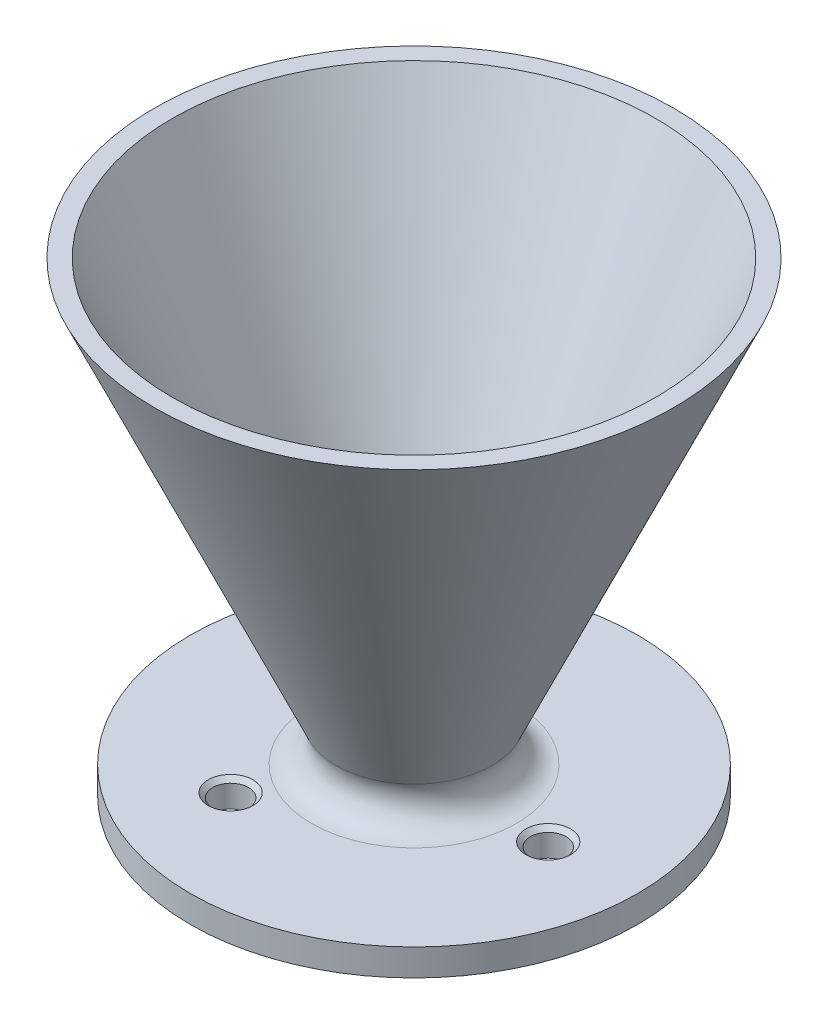
ISO-10303-21;
HEADER;
FILE_DESCRIPTION(('STEP AP214'),'2;1');
FILE_NAME('part.step','',(''),(''),'','','');
FILE_SCHEMA(('AUTOMOTIVE_DESIGN { 1 0 10303 214 1 1 1 1 }'));
ENDSEC;
DATA;
#1=APPLICATION_CONTEXT('core data for automotive mechanical design processes');
#2=APPLICATION_PROTOCOL_DEFINITION('international standard','automotive_design',2000,#1);
#3=PRODUCT_CONTEXT('',#1,'mechanical');
#4=PRODUCT('Part','Part','',(#3));
#5=PRODUCT_RELATED_PRODUCT_CATEGORY('part','',(#4));
#6=PRODUCT_DEFINITION_FORMATION('','',#4);
#7=PRODUCT_DEFINITION_CONTEXT('part definition',#1,'design');
#8=PRODUCT_DEFINITION('design','',#6,#7);
#9=PRODUCT_DEFINITION_SHAPE('','',#8);
#10=(LENGTH_UNIT() NAMED_UNIT(*) SI_UNIT(.MILLI.,.METRE.));
#11=(NAMED_UNIT(*) PLANE_ANGLE_UNIT() SI_UNIT($,.RADIAN.));
#12=(NAMED_UNIT(*) SI_UNIT($,.STERADIAN.) SOLID_ANGLE_UNIT());
#13=UNCERTAINTY_MEASURE_WITH_UNIT(LENGTH_MEASURE(1.E-05),#10,'distance_accuracy_value','');
#14=(GEOMETRIC_REPRESENTATION_CONTEXT(3) GLOBAL_UNCERTAINTY_ASSIGNED_CONTEXT((#13)) GLOBAL_UNIT_ASSIGNED_CONTEXT((#10,
#11,#12)) REPRESENTATION_CONTEXT('',''));
#15=CARTESIAN_POINT('',(0.,0.,0.));
#16=DIRECTION('',(0.,0.,1.));
#17=DIRECTION('',(1.,0.,0.));
#18=AXIS2_PLACEMENT_3D('',#15,#16,#17);
#19=CARTESIAN_POINT('',(0.,3.,0.));
#20=DIRECTION('',(0.,1.,0.));
#21=DIRECTION('',(0.,0.,1.));
#22=AXIS2_PLACEMENT_3D('',#19,#20,#21);
#23=PLANE('',#22);
#24=CARTESIAN_POINT('',(0.,3.,0.));
#25=DIRECTION('',(0.,1.,0.));
#26=DIRECTION('',(0.,0.,1.));
#27=AXIS2_PLACEMENT_3D('',#24,#25,#26);
#28=CIRCLE('',#27,11.4527198062947);
#29=CARTESIAN_POINT('',(0.,3.,11.4527198062947));
#30=VERTEX_POINT('',#29);
#31=EDGE_CURVE('E46',#30,#30,#28,.F.);
#32=ORIENTED_EDGE('',*,*,#31,.T.);
#33=EDGE_LOOP('',(#32));
#34=FACE_BOUND('',#33,.T.);
#35=CARTESIAN_POINT('',(0.,3.,0.));
#36=DIRECTION('',(0.,1.,0.));
#37=DIRECTION('',(0.,0.,1.));
#38=AXIS2_PLACEMENT_3D('',#35,#36,#37);
#39=CIRCLE('',#38,25.);
#40=CARTESIAN_POINT('',(0.,3.,25.));
#41=VERTEX_POINT('',#40);
#42=EDGE_CURVE('E50',#41,#41,#39,.T.);
#43=ORIENTED_EDGE('',*,*,#42,.T.);
#44=EDGE_LOOP('',(#43));
#45=FACE_BOUND('',#44,.T.);
#46=CARTESIAN_POINT('',(-7.49999999999988,3.,-12.9903810567666));
#47=DIRECTION('',(0.,1.,0.));
#48=DIRECTION('',(0.,0.,1.));
#49=AXIS2_PLACEMENT_3D('',#46,#47,#48);
#50=CIRCLE('',#49,2.5);
#51=CARTESIAN_POINT('',(-7.49999999999988,3.,-10.4903810567666));
#52=VERTEX_POINT('',#51);
#53=EDGE_CURVE('E68',#52,#52,#50,.T.);
#54=ORIENTED_EDGE('',*,*,#53,.F.);
#55=EDGE_LOOP('',(#54));
#56=FACE_BOUND('',#55,.T.);
#57=CARTESIAN_POINT('',(-7.50000000000006,3.,12.9903810567665));
#58=DIRECTION('',(0.,1.,0.));
#59=DIRECTION('',(0.,0.,1.));
#60=AXIS2_PLACEMENT_3D('',#57,#58,#59);
#61=CIRCLE('',#60,2.5);
#62=CARTESIAN_POINT('',(-7.50000000000006,3.,15.4903810567665));
#63=VERTEX_POINT('',#62);
#64=EDGE_CURVE('E77',#63,#63,#61,.T.);
#65=ORIENTED_EDGE('',*,*,#64,.F.);
#66=EDGE_LOOP('',(#65));
#67=FACE_BOUND('',#66,.T.);
#68=CARTESIAN_POINT('',(15.,3.,0.));
#69=DIRECTION('',(0.,1.,0.));
#70=DIRECTION('',(0.,0.,1.));
#71=AXIS2_PLACEMENT_3D('',#68,#69,#70);
#72=CIRCLE('',#71,2.5);
#73=CARTESIAN_POINT('',(15.,3.,2.5));
#74=VERTEX_POINT('',#73);
#75=EDGE_CURVE('E86',#74,#74,#72,.T.);
#76=ORIENTED_EDGE('',*,*,#75,.F.);
#77=EDGE_LOOP('',(#76));
#78=FACE_BOUND('',#77,.T.);
#79=ADVANCED_FACE('F39',(#34,#45,#56,#67,#78),#23,.T.);
#80=CARTESIAN_POINT('',(0.,0.,0.));
#81=DIRECTION('',(0.,1.,0.));
#82=DIRECTION('',(0.,0.,1.));
#83=AXIS2_PLACEMENT_3D('',#80,#81,#82);
#84=PLANE('',#83);
#85=CARTESIAN_POINT('',(15.,0.,0.));
#86=DIRECTION('',(0.,1.,0.));
#87=DIRECTION('',(0.,0.,1.));
#88=AXIS2_PLACEMENT_3D('',#85,#86,#87);
#89=CIRCLE('',#88,2.);
#90=CARTESIAN_POINT('',(15.,0.,2.));
#91=VERTEX_POINT('',#90);
#92=EDGE_CURVE('E80',#91,#91,#89,.T.);
#93=ORIENTED_EDGE('',*,*,#92,.T.);
#94=EDGE_LOOP('',(#93));
#95=FACE_BOUND('',#94,.T.);
#96=CARTESIAN_POINT('',(-7.50000000000006,0.,12.9903810567665));
#97=DIRECTION('',(0.,1.,0.));
#98=DIRECTION('',(0.,0.,1.));
#99=AXIS2_PLACEMENT_3D('',#96,#97,#98);
#100=CIRCLE('',#99,2.);
#101=CARTESIAN_POINT('',(-7.50000000000006,0.,14.9903810567665));
#102=VERTEX_POINT('',#101);
#103=EDGE_CURVE('E71',#102,#102,#100,.T.);
#104=ORIENTED_EDGE('',*,*,#103,.T.);
#105=EDGE_LOOP('',(#104));
#106=FACE_BOUND('',#105,.T.);
#107=CARTESIAN_POINT('',(-7.49999999999988,0.,-12.9903810567666));
#108=DIRECTION('',(0.,1.,0.));
#109=DIRECTION('',(0.,0.,1.));
#110=AXIS2_PLACEMENT_3D('',#107,#108,#109);
#111=CIRCLE('',#110,2.);
#112=CARTESIAN_POINT('',(-7.49999999999988,0.,-10.9903810567667));
#113=VERTEX_POINT('',#112);
#114=EDGE_CURVE('E62',#113,#113,#111,.T.);
#115=ORIENTED_EDGE('',*,*,#114,.T.);
#116=EDGE_LOOP('',(#115));
#117=FACE_BOUND('',#116,.T.);
#118=CARTESIAN_POINT('',(0.,0.,0.));
#119=DIRECTION('',(0.,1.,0.));
#120=DIRECTION('',(0.,0.,1.));
#121=AXIS2_PLACEMENT_3D('',#118,#119,#120);
#122=CIRCLE('',#121,25.);
#123=CARTESIAN_POINT('',(0.,0.,25.));
#124=VERTEX_POINT('',#123);
#125=EDGE_CURVE('E54',#124,#124,#122,.T.);
#126=ORIENTED_EDGE('',*,*,#125,.F.);
#127=EDGE_LOOP('',(#126));
#128=FACE_BOUND('',#127,.T.);
#129=CARTESIAN_POINT('',(0.,0.,0.));
#130=DIRECTION('',(0.,1.,0.));
#131=DIRECTION('',(0.,0.,1.));
#132=AXIS2_PLACEMENT_3D('',#129,#130,#131);
#133=CIRCLE('',#132,4.8);
#134=CARTESIAN_POINT('',(0.,0.,4.8));
#135=VERTEX_POINT('',#134);
#136=EDGE_CURVE('E58',#135,#135,#133,.T.);
#137=ORIENTED_EDGE('',*,*,#136,.T.);
#138=EDGE_LOOP('',(#137));
#139=FACE_BOUND('',#138,.T.);
#140=ADVANCED_FACE('F109',(#95,#106,#117,#128,#139),#84,.F.);
#141=CARTESIAN_POINT('',(0.,3.,0.));
#142=DIRECTION('',(0.,-1.,0.));
#143=DIRECTION('',(0.,0.,-1.));
#144=AXIS2_PLACEMENT_3D('',#141,#142,#143);
#145=CYLINDRICAL_SURFACE('',#144,25.);
#146=ORIENTED_EDGE('',*,*,#42,.F.);
#147=EDGE_LOOP('',(#146));
#148=FACE_BOUND('',#147,.T.);
#149=ORIENTED_EDGE('',*,*,#125,.T.);
#150=EDGE_LOOP('',(#149));
#151=FACE_BOUND('',#150,.T.);
#152=ADVANCED_FACE('F105',(#148,#151),#145,.T.);
#153=CARTESIAN_POINT('',(0.,3.,0.));
#154=DIRECTION('',(0.,-1.,0.));
#155=DIRECTION('',(0.,0.,-1.));
#156=AXIS2_PLACEMENT_3D('',#153,#154,#155);
#157=CYLINDRICAL_SURFACE('',#156,4.8);
#158=CARTESIAN_POINT('',(0.,3.,0.));
#159=DIRECTION('',(0.,-1.,0.));
#160=DIRECTION('',(0.,0.,-1.));
#161=AXIS2_PLACEMENT_3D('',#158,#159,#160);
#162=CIRCLE('',#161,4.8);
#163=CARTESIAN_POINT('',(0.,3.,4.8));
#164=VERTEX_POINT('',#163);
#165=EDGE_CURVE('E95',#164,#164,#162,.T.);
#166=ORIENTED_EDGE('',*,*,#165,.F.);
#167=EDGE_LOOP('',(#166));
#168=FACE_BOUND('',#167,.T.);
#169=ORIENTED_EDGE('',*,*,#136,.F.);
#170=EDGE_LOOP('',(#169));
#171=FACE_BOUND('',#170,.T.);
#172=ADVANCED_FACE('F101',(#168,#171),#157,.F.);
#173=CARTESIAN_POINT('',(-7.49999999999988,3.,-12.9903810567666));
#174=DIRECTION('',(0.,1.,0.));
#175=DIRECTION('',(0.,0.,1.));
#176=AXIS2_PLACEMENT_3D('',#173,#174,#175);
#177=CYLINDRICAL_SURFACE('',#176,2.);
#178=ORIENTED_EDGE('',*,*,#114,.F.);
#179=EDGE_LOOP('',(#178));
#180=FACE_BOUND('',#179,.T.);
#181=CARTESIAN_POINT('',(-7.49999999999988,2.5,-12.9903810567666));
#182=DIRECTION('',(0.,1.,0.));
#183=DIRECTION('',(0.,0.,1.));
#184=AXIS2_PLACEMENT_3D('',#181,#182,#183);
#185=CIRCLE('',#184,2.);
#186=CARTESIAN_POINT('',(-7.49999999999988,2.5,-10.9903810567667));
#187=VERTEX_POINT('',#186);
#188=EDGE_CURVE('E65',#187,#187,#185,.T.);
#189=ORIENTED_EDGE('',*,*,#188,.T.);
#190=EDGE_LOOP('',(#189));
#191=FACE_BOUND('',#190,.T.);
#192=ADVANCED_FACE('F104',(#180,#191),#177,.F.);
#193=CARTESIAN_POINT('',(-7.49999999999988,3.,-12.9903810567666));
#194=DIRECTION('',(0.,1.,0.));
#195=DIRECTION('',(0.,0.,1.));
#196=AXIS2_PLACEMENT_3D('',#193,#194,#195);
#197=CONICAL_SURFACE('',#196,2.5,0.785398163397449);
#198=ORIENTED_EDGE('',*,*,#188,.F.);
#199=EDGE_LOOP('',(#198));
#200=FACE_BOUND('',#199,.T.);
#201=ORIENTED_EDGE('',*,*,#53,.T.);
#202=EDGE_LOOP('',(#201));
#203=FACE_BOUND('',#202,.T.);
#204=ADVANCED_FACE('F123',(#200,#203),#197,.F.);
#205=CARTESIAN_POINT('',(-7.50000000000006,3.,12.9903810567665));
#206=DIRECTION('',(0.,1.,0.));
#207=DIRECTION('',(0.,0.,1.));
#208=AXIS2_PLACEMENT_3D('',#205,#206,#207);
#209=CYLINDRICAL_SURFACE('',#208,2.);
#210=ORIENTED_EDGE('',*,*,#103,.F.);
#211=EDGE_LOOP('',(#210));
#212=FACE_BOUND('',#211,.T.);
#213=CARTESIAN_POINT('',(-7.50000000000006,2.5,12.9903810567665));
#214=DIRECTION('',(0.,1.,0.));
#215=DIRECTION('',(0.,0.,1.));
#216=AXIS2_PLACEMENT_3D('',#213,#214,#215);
#217=CIRCLE('',#216,2.);
#218=CARTESIAN_POINT('',(-7.50000000000006,2.5,14.9903810567665));
#219=VERTEX_POINT('',#218);
#220=EDGE_CURVE('E74',#219,#219,#217,.T.);
#221=ORIENTED_EDGE('',*,*,#220,.T.);
#222=EDGE_LOOP('',(#221));
#223=FACE_BOUND('',#222,.T.);
#224=ADVANCED_FACE('F127',(#212,#223),#209,.F.);
#225=CARTESIAN_POINT('',(-7.50000000000006,3.,12.9903810567665));
#226=DIRECTION('',(0.,1.,0.));
#227=DIRECTION('',(0.,0.,1.));
#228=AXIS2_PLACEMENT_3D('',#225,#226,#227);
#229=CONICAL_SURFACE('',#228,2.5,0.785398163397449);
#230=ORIENTED_EDGE('',*,*,#220,.F.);
#231=EDGE_LOOP('',(#230));
#232=FACE_BOUND('',#231,.T.);
#233=ORIENTED_EDGE('',*,*,#64,.T.);
#234=EDGE_LOOP('',(#233));
#235=FACE_BOUND('',#234,.T.);
#236=ADVANCED_FACE('F131',(#232,#235),#229,.F.);
#237=CARTESIAN_POINT('',(15.,3.,0.));
#238=DIRECTION('',(0.,1.,0.));
#239=DIRECTION('',(0.,0.,1.));
#240=AXIS2_PLACEMENT_3D('',#237,#238,#239);
#241=CYLINDRICAL_SURFACE('',#240,2.);
#242=ORIENTED_EDGE('',*,*,#92,.F.);
#243=EDGE_LOOP('',(#242));
#244=FACE_BOUND('',#243,.T.);
#245=CARTESIAN_POINT('',(15.,2.5,0.));
#246=DIRECTION('',(0.,1.,0.));
#247=DIRECTION('',(0.,0.,1.));
#248=AXIS2_PLACEMENT_3D('',#245,#246,#247);
#249=CIRCLE('',#248,2.);
#250=CARTESIAN_POINT('',(15.,2.5,2.));
#251=VERTEX_POINT('',#250);
#252=EDGE_CURVE('E83',#251,#251,#249,.T.);
#253=ORIENTED_EDGE('',*,*,#252,.T.);
#254=EDGE_LOOP('',(#253));
#255=FACE_BOUND('',#254,.T.);
#256=ADVANCED_FACE('F135',(#244,#255),#241,.F.);
#257=CARTESIAN_POINT('',(15.,3.,0.));
#258=DIRECTION('',(0.,1.,0.));
#259=DIRECTION('',(0.,0.,1.));
#260=AXIS2_PLACEMENT_3D('',#257,#258,#259);
#261=CONICAL_SURFACE('',#260,2.5,0.785398163397448);
#262=ORIENTED_EDGE('',*,*,#252,.F.);
#263=EDGE_LOOP('',(#262));
#264=FACE_BOUND('',#263,.T.);
#265=ORIENTED_EDGE('',*,*,#75,.T.);
#266=EDGE_LOOP('',(#265));
#267=FACE_BOUND('',#266,.T.);
#268=ADVANCED_FACE('F139',(#264,#267),#261,.F.);
#269=CARTESIAN_POINT('',(0.,52.,0.));
#270=DIRECTION('',(0.,1.,0.));
#271=DIRECTION('',(0.,0.,1.));
#272=AXIS2_PLACEMENT_3D('',#269,#270,#271);
#273=CONICAL_SURFACE('',#272,29.,0.42539672451756);
#274=CARTESIAN_POINT('',(0.,7.2380465420643,0.));
#275=DIRECTION('',(0.,-1.,0.));
#276=DIRECTION('',(0.,0.,-1.));
#277=AXIS2_PLACEMENT_3D('',#274,#275,#276);
#278=CIRCLE('',#277,8.7200945557924);
#279=CARTESIAN_POINT('',(0.,7.23804654206429,8.72009455579239));
#280=VERTEX_POINT('',#279);
#281=EDGE_CURVE('E10',#280,#280,#278,.F.);
#282=CARTESIAN_POINT('',(0.,52.,0.));
#283=DIRECTION('',(0.,-1.,0.));
#284=DIRECTION('',(0.,0.,-1.));
#285=AXIS2_PLACEMENT_3D('',#282,#283,#284);
#286=CIRCLE('',#285,29.);
#287=CARTESIAN_POINT('',(0.,52.,29.));
#288=VERTEX_POINT('',#287);
#289=EDGE_CURVE('E89',#288,#288,#286,.T.);
#290=CARTESIAN_POINT('',(0.,7.23804654206429,8.72009455579239));
#291=CARTESIAN_POINT('',(0.,7.70431689058446,8.93134357083622));
#292=CARTESIAN_POINT('',(0.,8.17058723910462,9.14259258588005));
#293=CARTESIAN_POINT('',(0.,9.10312793614495,9.56509061596771));
#294=CARTESIAN_POINT('',(0.,9.56939828466512,9.77633963101154));
#295=CARTESIAN_POINT('',(0.,10.5019389817054,10.1988376610992));
#296=CARTESIAN_POINT('',(0.,10.9682093302256,10.410086676143));
#297=CARTESIAN_POINT('',(0.,11.9007500272659,10.8325847062307));
#298=CARTESIAN_POINT('',(0.,12.3670203757861,11.0438337212745));
#299=CARTESIAN_POINT('',(0.,13.2995610728264,11.4663317513622));
#300=CARTESIAN_POINT('',(0.,13.7658314213466,11.677580766406));
#301=CARTESIAN_POINT('',(0.,14.6983721183869,12.1000787964937));
#302=CARTESIAN_POINT('',(0.,15.1646424669071,12.3113278115375));
#303=CARTESIAN_POINT('',(0.,16.0971831639474,12.7338258416252));
#304=CARTESIAN_POINT('',(0.,16.5634535124676,12.945074856669));
#305=CARTESIAN_POINT('',(0.,17.4959942095079,13.3675728867566));
#306=CARTESIAN_POINT('',(0.,17.9622645580281,13.5788219018005));
#307=CARTESIAN_POINT('',(0.,18.8948052550684,14.0013199318881));
#308=CARTESIAN_POINT('',(0.,19.3610756035885,14.212568946932));
#309=CARTESIAN_POINT('',(0.,20.2936163006289,14.6350669770196));
#310=CARTESIAN_POINT('',(0.,20.759886649149,14.8463159920634));
#311=CARTESIAN_POINT('',(0.,21.6924273461894,15.2688140221511));
#312=CARTESIAN_POINT('',(0.,22.1586976947095,15.4800630371949));
#313=CARTESIAN_POINT('',(0.,23.0912383917499,15.9025610672826));
#314=CARTESIAN_POINT('',(0.,23.55750874027,16.1138100823264));
#315=CARTESIAN_POINT('',(0.,24.4900494373104,16.5363081124141));
#316=CARTESIAN_POINT('',(0.,24.9563197858305,16.7475571274579));
#317=CARTESIAN_POINT('',(0.,25.8888604828708,17.1700551575456));
#318=CARTESIAN_POINT('',(0.,26.355130831391,17.3813041725894));
#319=CARTESIAN_POINT('',(0.,27.2876715284313,17.8038022026771));
#320=CARTESIAN_POINT('',(0.,27.7539418769515,18.0150512177209));
#321=CARTESIAN_POINT('',(0.,28.6864825739918,18.4375492478085));
#322=CARTESIAN_POINT('',(0.,29.152752922512,18.6487982628524));
#323=CARTESIAN_POINT('',(0.,30.0852936195523,19.07129629294));
#324=CARTESIAN_POINT('',(0.,30.5515639680725,19.2825453079839));
#325=CARTESIAN_POINT('',(0.,31.4841046651128,19.7050433380715));
#326=CARTESIAN_POINT('',(0.,31.950375013633,19.9162923531153));
#327=CARTESIAN_POINT('',(0.,32.8829157106733,20.338790383203));
#328=CARTESIAN_POINT('',(0.,33.3491860591935,20.5500393982468));
#329=CARTESIAN_POINT('',(0.,34.2817267562338,20.9725374283345));
#330=CARTESIAN_POINT('',(0.,34.747997104754,21.1837864433783));
#331=CARTESIAN_POINT('',(0.,35.6805378017943,21.606284473466));
#332=CARTESIAN_POINT('',(0.,36.1468081503144,21.8175334885098));
#333=CARTESIAN_POINT('',(0.,37.0793488473548,22.2400315185975));
#334=CARTESIAN_POINT('',(0.,37.5456191958749,22.4512805336413));
#335=CARTESIAN_POINT('',(0.,38.4781598929153,22.873778563729));
#336=CARTESIAN_POINT('',(0.,38.9444302414354,23.0850275787728));
#337=CARTESIAN_POINT('',(0.,39.8769709384758,23.5075256088604));
#338=CARTESIAN_POINT('',(0.,40.3432412869959,23.7187746239043));
#339=CARTESIAN_POINT('',(0.,41.2757819840362,24.1412726539919));
#340=CARTESIAN_POINT('',(0.,41.7420523325564,24.3525216690358));
#341=CARTESIAN_POINT('',(0.,42.6745930295967,24.7750196991234));
#342=CARTESIAN_POINT('',(0.,43.1408633781169,24.9862687141672));
#343=CARTESIAN_POINT('',(0.,44.0734040751572,25.4087667442549));
#344=CARTESIAN_POINT('',(0.,44.5396744236774,25.6200157592987));
#345=CARTESIAN_POINT('',(0.,45.4722151207177,26.0425137893864));
#346=CARTESIAN_POINT('',(0.,45.9384854692379,26.2537628044302));
#347=CARTESIAN_POINT('',(0.,46.8710261662782,26.6762608345179));
#348=CARTESIAN_POINT('',(0.,47.3372965147984,26.8875098495617));
#349=CARTESIAN_POINT('',(0.,48.2698372118387,27.3100078796494));
#350=CARTESIAN_POINT('',(0.,48.7361075603589,27.5212568946932));
#351=CARTESIAN_POINT('',(0.,49.6686482573992,27.9437549247809));
#352=CARTESIAN_POINT('',(0.,50.1349186059194,28.1550039398247));
#353=CARTESIAN_POINT('',(0.,51.0674593029597,28.5775019699123));
#354=CARTESIAN_POINT('',(0.,51.5337296514799,28.7887509849562));
#355=CARTESIAN_POINT('',(0.,52.,29.));
#356=B_SPLINE_CURVE_WITH_KNOTS('',3,(#290,#291,#292,#293,#294,#295,#296,#297,#298,#299,#300,
#301,#302,#303,#304,#305,#306,#307,#308,#309,#310,#311,#312,#313,#314,#315,#316,#317,#318,#319,
#320,#321,#322,#323,#324,#325,#326,#327,#328,#329,#330,#331,#332,#333,#334,#335,#336,#337,#338,
#339,#340,#341,#342,#343,#344,#345,#346,#347,#348,#349,#350,#351,#352,#353,#354,#355),
.UNSPECIFIED.,.F.,.F.,(4,2,2,2,2,2,2,2,2,2,2,2,2,2,2,2,2,2,2,2,2,2,2,2,2,2,2,2,2,2,2,2,4),(0.,
1.5356782405162,3.0713564810324,4.60703472154859,6.14271296206479,7.67839120258099,
9.21406944309719,10.7497476836134,12.2854259241296,13.8211041646458,15.356782405162,
16.8924606456782,18.4281388861944,19.9638171267106,21.4994953672268,23.035173607743,
24.5708518482592,26.1065300887754,27.6422083292916,29.1778865698078,30.713564810324,
32.2492430508402,33.7849212913564,35.3205995318726,36.8562777723888,38.391956012905,
39.9276342534211,41.4633124939374,42.9989907344536,44.5346689749698,46.0703472154859,
47.6060254560022,49.1417036965183),.UNSPECIFIED.);
#357=EDGE_CURVE('BSEAM143',#280,#288,#356,.T.);
#358=ORIENTED_EDGE('',*,*,#281,.T.);
#359=ORIENTED_EDGE('',*,*,#289,.T.);
#360=ORIENTED_EDGE('',*,*,#357,.T.);
#361=ORIENTED_EDGE('',*,*,#357,.F.);
#362=EDGE_LOOP('',(#358,#360,#359,#361));
#363=FACE_BOUND('',#362,.T.);
#364=ADVANCED_FACE('F143',(#363),#273,.T.);
#365=CARTESIAN_POINT('',(0.,52.,0.));
#366=DIRECTION('',(0.,-1.,0.));
#367=DIRECTION('',(0.,0.,-1.));
#368=AXIS2_PLACEMENT_3D('',#365,#366,#367);
#369=PLANE('',#368);
#370=ORIENTED_EDGE('',*,*,#289,.F.);
#371=EDGE_LOOP('',(#370));
#372=FACE_BOUND('',#371,.T.);
#373=CARTESIAN_POINT('',(0.,52.,0.));
#374=DIRECTION('',(0.,-1.,0.));
#375=DIRECTION('',(0.,0.,-1.));
#376=AXIS2_PLACEMENT_3D('',#373,#374,#375);
#377=CIRCLE('',#376,27.);
#378=CARTESIAN_POINT('',(0.,52.,27.));
#379=VERTEX_POINT('',#378);
#380=EDGE_CURVE('E92',#379,#379,#377,.T.);
#381=ORIENTED_EDGE('',*,*,#380,.T.);
#382=EDGE_LOOP('',(#381));
#383=FACE_BOUND('',#382,.T.);
#384=ADVANCED_FACE('F147',(#372,#383),#369,.F.);
#385=CARTESIAN_POINT('',(0.,3.,0.));
#386=DIRECTION('',(0.,1.,0.));
#387=DIRECTION('',(0.,0.,1.));
#388=AXIS2_PLACEMENT_3D('',#385,#386,#387);
#389=CONICAL_SURFACE('',#388,4.8,0.42539672451756);
#390=CARTESIAN_POINT('',(0.,52.,27.));
#391=CARTESIAN_POINT('',(0.,51.4895833333333,26.76875));
#392=CARTESIAN_POINT('',(0.,50.9791666666667,26.5375));
#393=CARTESIAN_POINT('',(0.,49.9583333333333,26.075));
#394=CARTESIAN_POINT('',(0.,49.4479166666667,25.84375));
#395=CARTESIAN_POINT('',(0.,48.4270833333333,25.38125));
#396=CARTESIAN_POINT('',(0.,47.9166666666667,25.15));
#397=CARTESIAN_POINT('',(0.,46.8958333333333,24.6875));
#398=CARTESIAN_POINT('',(0.,46.3854166666667,24.45625));
#399=CARTESIAN_POINT('',(0.,45.3645833333333,23.99375));
#400=CARTESIAN_POINT('',(0.,44.8541666666667,23.7625));
#401=CARTESIAN_POINT('',(0.,43.8333333333333,23.3));
#402=CARTESIAN_POINT('',(0.,43.3229166666667,23.06875));
#403=CARTESIAN_POINT('',(0.,42.3020833333333,22.60625));
#404=CARTESIAN_POINT('',(0.,41.7916666666667,22.375));
#405=CARTESIAN_POINT('',(0.,40.7708333333333,21.9125));
#406=CARTESIAN_POINT('',(0.,40.2604166666667,21.68125));
#407=CARTESIAN_POINT('',(0.,39.2395833333333,21.21875));
#408=CARTESIAN_POINT('',(0.,38.7291666666667,20.9875));
#409=CARTESIAN_POINT('',(0.,37.7083333333333,20.525));
#410=CARTESIAN_POINT('',(0.,37.1979166666667,20.29375));
#411=CARTESIAN_POINT('',(0.,36.1770833333333,19.83125));
#412=CARTESIAN_POINT('',(0.,35.6666666666667,19.6));
#413=CARTESIAN_POINT('',(0.,34.6458333333333,19.1375));
#414=CARTESIAN_POINT('',(0.,34.1354166666667,18.90625));
#415=CARTESIAN_POINT('',(0.,33.1145833333333,18.44375));
#416=CARTESIAN_POINT('',(0.,32.6041666666667,18.2125));
#417=CARTESIAN_POINT('',(0.,31.5833333333333,17.75));
#418=CARTESIAN_POINT('',(0.,31.0729166666667,17.51875));
#419=CARTESIAN_POINT('',(0.,30.0520833333333,17.05625));
#420=CARTESIAN_POINT('',(0.,29.5416666666667,16.825));
#421=CARTESIAN_POINT('',(0.,28.5208333333333,16.3625));
#422=CARTESIAN_POINT('',(0.,28.0104166666667,16.13125));
#423=CARTESIAN_POINT('',(0.,26.9895833333333,15.66875));
#424=CARTESIAN_POINT('',(0.,26.4791666666667,15.4375));
#425=CARTESIAN_POINT('',(0.,25.4583333333333,14.975));
#426=CARTESIAN_POINT('',(0.,24.9479166666667,14.74375));
#427=CARTESIAN_POINT('',(0.,23.9270833333333,14.28125));
#428=CARTESIAN_POINT('',(0.,23.4166666666667,14.05));
#429=CARTESIAN_POINT('',(0.,22.3958333333333,13.5875));
#430=CARTESIAN_POINT('',(0.,21.8854166666667,13.35625));
#431=CARTESIAN_POINT('',(0.,20.8645833333333,12.89375));
#432=CARTESIAN_POINT('',(0.,20.3541666666667,12.6625));
#433=CARTESIAN_POINT('',(0.,19.3333333333333,12.2));
#434=CARTESIAN_POINT('',(0.,18.8229166666667,11.96875));
#435=CARTESIAN_POINT('',(0.,17.8020833333333,11.50625));
#436=CARTESIAN_POINT('',(0.,17.2916666666667,11.275));
#437=CARTESIAN_POINT('',(0.,16.2708333333333,10.8125));
#438=CARTESIAN_POINT('',(0.,15.7604166666667,10.58125));
#439=CARTESIAN_POINT('',(0.,14.7395833333333,10.11875));
#440=CARTESIAN_POINT('',(0.,14.2291666666667,9.8875));
#441=CARTESIAN_POINT('',(0.,13.2083333333333,9.425));
#442=CARTESIAN_POINT('',(0.,12.6979166666667,9.19375));
#443=CARTESIAN_POINT('',(0.,11.6770833333333,8.73125));
#444=CARTESIAN_POINT('',(0.,11.1666666666667,8.5));
#445=CARTESIAN_POINT('',(0.,10.1458333333333,8.0375));
#446=CARTESIAN_POINT('',(0.,9.63541666666667,7.80625));
#447=CARTESIAN_POINT('',(0.,8.61458333333333,7.34375));
#448=CARTESIAN_POINT('',(0.,8.10416666666667,7.1125));
#449=CARTESIAN_POINT('',(0.,7.08333333333333,6.65));
#450=CARTESIAN_POINT('',(0.,6.57291666666667,6.41875));
#451=CARTESIAN_POINT('',(0.,5.55208333333333,5.95625));
#452=CARTESIAN_POINT('',(0.,5.04166666666667,5.725));
#453=CARTESIAN_POINT('',(0.,4.02083333333333,5.2625));
#454=CARTESIAN_POINT('',(0.,3.51041666666667,5.03125));
#455=CARTESIAN_POINT('',(0.,3.,4.8));
#456=B_SPLINE_CURVE_WITH_KNOTS('',3,(#390,#391,#392,#393,#394,#395,#396,#397,#398,#399,#400,
#401,#402,#403,#404,#405,#406,#407,#408,#409,#410,#411,#412,#413,#414,#415,#416,#417,#418,#419,
#420,#421,#422,#423,#424,#425,#426,#427,#428,#429,#430,#431,#432,#433,#434,#435,#436,#437,#438,
#439,#440,#441,#442,#443,#444,#445,#446,#447,#448,#449,#450,#451,#452,#453,#454,#455),
.UNSPECIFIED.,.F.,.F.,(4,2,2,2,2,2,2,2,2,2,2,2,2,2,2,2,2,2,2,2,2,2,2,2,2,2,2,2,2,2,2,2,4),(0.,
1.6810757344629,3.36215146892582,5.04322720338872,6.72430293785162,8.40537867231454,
10.0864544067774,11.7675301412403,13.4486058757032,15.1296816101662,16.8107573446291,
18.491833079092,20.1729088135549,21.8539845480178,23.5350602824807,25.2161360169436,
26.8972117514065,28.5782874858694,30.2593632203323,31.9404389547952,33.6215146892581,
35.302590423721,36.9836661581839,38.6647418926468,40.3458176271098,42.0268933615727,
43.7079690960356,45.3890448304985,47.0701205649614,48.7511962994243,50.4322720338872,
52.1133477683501,53.794423502813),.UNSPECIFIED.);
#457=EDGE_CURVE('BSEAM99',#379,#164,#456,.T.);
#458=ORIENTED_EDGE('',*,*,#380,.F.);
#459=ORIENTED_EDGE('',*,*,#165,.T.);
#460=ORIENTED_EDGE('',*,*,#457,.T.);
#461=ORIENTED_EDGE('',*,*,#457,.F.);
#462=EDGE_LOOP('',(#458,#460,#459,#461));
#463=FACE_BOUND('',#462,.T.);
#464=ADVANCED_FACE('F99',(#463),#389,.F.);
#465=CARTESIAN_POINT('',(0.,6.,0.));
#466=DIRECTION('',(0.,1.,0.));
#467=DIRECTION('',(0.,0.,1.));
#468=AXIS2_PLACEMENT_3D('',#465,#466,#467);
#469=TOROIDAL_SURFACE('',#468,11.4527198062947,3.);
#470=ORIENTED_EDGE('',*,*,#281,.F.);
#471=EDGE_LOOP('',(#470));
#472=FACE_BOUND('',#471,.T.);
#473=ORIENTED_EDGE('',*,*,#31,.F.);
#474=EDGE_LOOP('',(#473));
#475=FACE_BOUND('',#474,.T.);
#476=ADVANCED_FACE('F41',(#472,#475),#469,.F.);
#477=CLOSED_SHELL('',(#79,#140,#152,#172,#192,#204,#224,#236,#256,#268,#364,#384,#464,#476));
#478=MANIFOLD_SOLID_BREP('B2',#477);
#479=ADVANCED_BREP_SHAPE_REPRESENTATION('',(#18,#478),#14);
#480=SHAPE_DEFINITION_REPRESENTATION(#9,#479);
ENDSEC;
END-ISO-10303-21;
